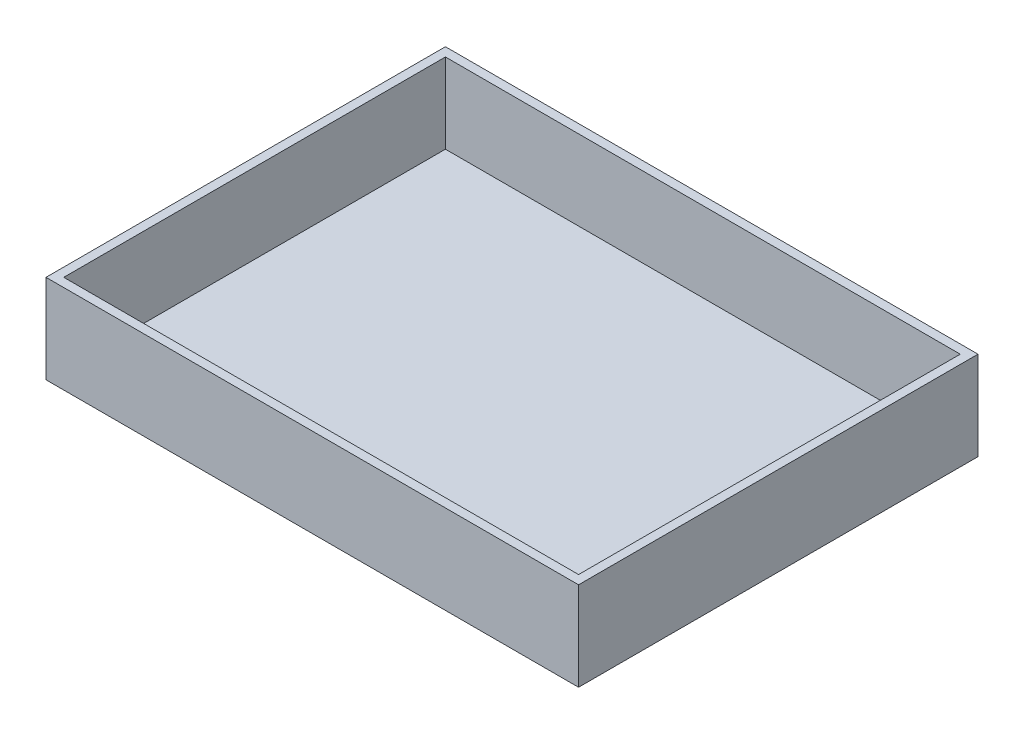
ISO-10303-21;
HEADER;
FILE_DESCRIPTION(('STEP AP214'),'2;1');
FILE_NAME('part.step','',(''),(''),'','','');
FILE_SCHEMA(('AUTOMOTIVE_DESIGN { 1 0 10303 214 1 1 1 1 }'));
ENDSEC;
DATA;
#1=APPLICATION_CONTEXT('core data for automotive mechanical design processes');
#2=APPLICATION_PROTOCOL_DEFINITION('international standard','automotive_design',2000,#1);
#3=PRODUCT_CONTEXT('',#1,'mechanical');
#4=PRODUCT('Part','Part','',(#3));
#5=PRODUCT_RELATED_PRODUCT_CATEGORY('part','',(#4));
#6=PRODUCT_DEFINITION_FORMATION('','',#4);
#7=PRODUCT_DEFINITION_CONTEXT('part definition',#1,'design');
#8=PRODUCT_DEFINITION('design','',#6,#7);
#9=PRODUCT_DEFINITION_SHAPE('','',#8);
#10=(LENGTH_UNIT() NAMED_UNIT(*) SI_UNIT(.MILLI.,.METRE.));
#11=(NAMED_UNIT(*) PLANE_ANGLE_UNIT() SI_UNIT($,.RADIAN.));
#12=(NAMED_UNIT(*) SI_UNIT($,.STERADIAN.) SOLID_ANGLE_UNIT());
#13=UNCERTAINTY_MEASURE_WITH_UNIT(LENGTH_MEASURE(1.E-05),#10,'distance_accuracy_value','');
#14=(GEOMETRIC_REPRESENTATION_CONTEXT(3) GLOBAL_UNCERTAINTY_ASSIGNED_CONTEXT((#13)) GLOBAL_UNIT_ASSIGNED_CONTEXT((#10,
#11,#12)) REPRESENTATION_CONTEXT('',''));
#15=CARTESIAN_POINT('',(0.,0.,0.));
#16=DIRECTION('',(0.,0.,1.));
#17=DIRECTION('',(1.,0.,0.));
#18=AXIS2_PLACEMENT_3D('',#15,#16,#17);
#19=CARTESIAN_POINT('',(0.,0.,-450.));
#20=DIRECTION('',(-1.,0.,0.));
#21=DIRECTION('',(0.,0.,1.));
#22=AXIS2_PLACEMENT_3D('',#19,#20,#21);
#23=PLANE('',#22);
#24=DIRECTION('',(0.,-1.,0.));
#25=VECTOR('',#24,1.);
#26=CARTESIAN_POINT('',(0.,0.,0.));
#27=LINE('',#26,#25);
#28=CARTESIAN_POINT('',(0.,0.,0.));
#29=VERTEX_POINT('',#28);
#30=CARTESIAN_POINT('',(0.,-100.,0.));
#31=VERTEX_POINT('',#30);
#32=EDGE_CURVE('E161',#29,#31,#27,.T.);
#33=ORIENTED_EDGE('',*,*,#32,.F.);
#34=DIRECTION('',(0.,0.,1.));
#35=VECTOR('',#34,1.);
#36=CARTESIAN_POINT('',(0.,0.,-450.));
#37=LINE('',#36,#35);
#38=CARTESIAN_POINT('',(0.,0.,-450.));
#39=VERTEX_POINT('',#38);
#40=EDGE_CURVE('E11',#39,#29,#37,.T.);
#41=ORIENTED_EDGE('',*,*,#40,.F.);
#42=DIRECTION('',(0.,-1.,0.));
#43=VECTOR('',#42,1.);
#44=CARTESIAN_POINT('',(0.,0.,-450.));
#45=LINE('',#44,#43);
#46=CARTESIAN_POINT('',(0.,-100.,-450.));
#47=VERTEX_POINT('',#46);
#48=EDGE_CURVE('E167',#39,#47,#45,.T.);
#49=ORIENTED_EDGE('',*,*,#48,.T.);
#50=DIRECTION('',(0.,0.,1.));
#51=VECTOR('',#50,1.);
#52=CARTESIAN_POINT('',(0.,-100.,-450.));
#53=LINE('',#52,#51);
#54=EDGE_CURVE('E46',#47,#31,#53,.T.);
#55=ORIENTED_EDGE('',*,*,#54,.T.);
#56=EDGE_LOOP('',(#33,#41,#49,#55));
#57=FACE_BOUND('',#56,.T.);
#58=ADVANCED_FACE('F43',(#57),#23,.T.);
#59=CARTESIAN_POINT('',(0.,0.,-450.));
#60=DIRECTION('',(0.,1.,0.));
#61=DIRECTION('',(0.,0.,1.));
#62=AXIS2_PLACEMENT_3D('',#59,#60,#61);
#63=PLANE('',#62);
#64=DIRECTION('',(0.,0.,1.));
#65=VECTOR('',#64,1.);
#66=CARTESIAN_POINT('',(10.,0.,-10.));
#67=LINE('',#66,#65);
#68=CARTESIAN_POINT('',(10.,0.,-440.));
#69=VERTEX_POINT('',#68);
#70=CARTESIAN_POINT('',(10.,0.,-10.));
#71=VERTEX_POINT('',#70);
#72=EDGE_CURVE('E60',#69,#71,#67,.T.);
#73=ORIENTED_EDGE('',*,*,#72,.F.);
#74=DIRECTION('',(-1.,0.,0.));
#75=VECTOR('',#74,1.);
#76=CARTESIAN_POINT('',(10.,0.,-440.));
#77=LINE('',#76,#75);
#78=CARTESIAN_POINT('',(590.,0.,-440.));
#79=VERTEX_POINT('',#78);
#80=EDGE_CURVE('E139',#79,#69,#77,.T.);
#81=ORIENTED_EDGE('',*,*,#80,.F.);
#82=DIRECTION('',(0.,0.,-1.));
#83=VECTOR('',#82,1.);
#84=CARTESIAN_POINT('',(590.,0.,-10.));
#85=LINE('',#84,#83);
#86=CARTESIAN_POINT('',(590.,0.,-10.));
#87=VERTEX_POINT('',#86);
#88=EDGE_CURVE('E143',#87,#79,#85,.T.);
#89=ORIENTED_EDGE('',*,*,#88,.F.);
#90=DIRECTION('',(1.,0.,0.));
#91=VECTOR('',#90,1.);
#92=CARTESIAN_POINT('',(10.,0.,-10.));
#93=LINE('',#92,#91);
#94=EDGE_CURVE('E152',#71,#87,#93,.T.);
#95=ORIENTED_EDGE('',*,*,#94,.F.);
#96=EDGE_LOOP('',(#73,#81,#89,#95));
#97=FACE_BOUND('',#96,.T.);
#98=DIRECTION('',(-1.,0.,0.));
#99=VECTOR('',#98,1.);
#100=CARTESIAN_POINT('',(0.,0.,0.));
#101=LINE('',#100,#99);
#102=CARTESIAN_POINT('',(600.,0.,0.));
#103=VERTEX_POINT('',#102);
#104=EDGE_CURVE('E171',#103,#29,#101,.T.);
#105=ORIENTED_EDGE('',*,*,#104,.F.);
#106=DIRECTION('',(0.,0.,1.));
#107=VECTOR('',#106,1.);
#108=CARTESIAN_POINT('',(600.,0.,-450.));
#109=LINE('',#108,#107);
#110=CARTESIAN_POINT('',(600.,0.,-450.));
#111=VERTEX_POINT('',#110);
#112=EDGE_CURVE('E52',#111,#103,#109,.T.);
#113=ORIENTED_EDGE('',*,*,#112,.F.);
#114=DIRECTION('',(-1.,0.,0.));
#115=VECTOR('',#114,1.);
#116=CARTESIAN_POINT('',(0.,0.,-450.));
#117=LINE('',#116,#115);
#118=EDGE_CURVE('E178',#111,#39,#117,.T.);
#119=ORIENTED_EDGE('',*,*,#118,.T.);
#120=ORIENTED_EDGE('',*,*,#40,.T.);
#121=EDGE_LOOP('',(#105,#113,#119,#120));
#122=FACE_BOUND('',#121,.T.);
#123=ADVANCED_FACE('F203',(#97,#122),#63,.T.);
#124=CARTESIAN_POINT('',(600.,0.,-450.));
#125=DIRECTION('',(1.,0.,0.));
#126=DIRECTION('',(0.,0.,-1.));
#127=AXIS2_PLACEMENT_3D('',#124,#125,#126);
#128=PLANE('',#127);
#129=DIRECTION('',(0.,1.,0.));
#130=VECTOR('',#129,1.);
#131=CARTESIAN_POINT('',(600.,0.,0.));
#132=LINE('',#131,#130);
#133=CARTESIAN_POINT('',(600.,-100.,0.));
#134=VERTEX_POINT('',#133);
#135=EDGE_CURVE('E188',#134,#103,#132,.T.);
#136=ORIENTED_EDGE('',*,*,#135,.F.);
#137=DIRECTION('',(0.,0.,1.));
#138=VECTOR('',#137,1.);
#139=CARTESIAN_POINT('',(600.,-100.,-450.));
#140=LINE('',#139,#138);
#141=CARTESIAN_POINT('',(600.,-100.,-450.));
#142=VERTEX_POINT('',#141);
#143=EDGE_CURVE('E196',#142,#134,#140,.T.);
#144=ORIENTED_EDGE('',*,*,#143,.F.);
#145=DIRECTION('',(0.,1.,0.));
#146=VECTOR('',#145,1.);
#147=CARTESIAN_POINT('',(600.,0.,-450.));
#148=LINE('',#147,#146);
#149=EDGE_CURVE('E174',#142,#111,#148,.T.);
#150=ORIENTED_EDGE('',*,*,#149,.T.);
#151=ORIENTED_EDGE('',*,*,#112,.T.);
#152=EDGE_LOOP('',(#136,#144,#150,#151));
#153=FACE_BOUND('',#152,.T.);
#154=ADVANCED_FACE('F207',(#153),#128,.T.);
#155=CARTESIAN_POINT('',(0.,-100.,-450.));
#156=DIRECTION('',(0.,-1.,0.));
#157=DIRECTION('',(0.,0.,-1.));
#158=AXIS2_PLACEMENT_3D('',#155,#156,#157);
#159=PLANE('',#158);
#160=DIRECTION('',(1.,0.,0.));
#161=VECTOR('',#160,1.);
#162=CARTESIAN_POINT('',(0.,-100.,0.));
#163=LINE('',#162,#161);
#164=EDGE_CURVE('E184',#31,#134,#163,.T.);
#165=ORIENTED_EDGE('',*,*,#164,.F.);
#166=ORIENTED_EDGE('',*,*,#54,.F.);
#167=DIRECTION('',(1.,0.,0.));
#168=VECTOR('',#167,1.);
#169=CARTESIAN_POINT('',(0.,-100.,-450.));
#170=LINE('',#169,#168);
#171=EDGE_CURVE('E170',#47,#142,#170,.T.);
#172=ORIENTED_EDGE('',*,*,#171,.T.);
#173=ORIENTED_EDGE('',*,*,#143,.T.);
#174=EDGE_LOOP('',(#165,#166,#172,#173));
#175=FACE_BOUND('',#174,.T.);
#176=ADVANCED_FACE('F200',(#175),#159,.T.);
#177=CARTESIAN_POINT('',(0.,0.,-450.));
#178=DIRECTION('',(0.,0.,1.));
#179=DIRECTION('',(1.,0.,0.));
#180=AXIS2_PLACEMENT_3D('',#177,#178,#179);
#181=PLANE('',#180);
#182=ORIENTED_EDGE('',*,*,#48,.F.);
#183=ORIENTED_EDGE('',*,*,#118,.F.);
#184=ORIENTED_EDGE('',*,*,#149,.F.);
#185=ORIENTED_EDGE('',*,*,#171,.F.);
#186=EDGE_LOOP('',(#182,#183,#184,#185));
#187=FACE_BOUND('',#186,.T.);
#188=ADVANCED_FACE('F209',(#187),#181,.F.);
#189=CARTESIAN_POINT('',(0.,0.,0.));
#190=DIRECTION('',(0.,0.,1.));
#191=DIRECTION('',(1.,0.,0.));
#192=AXIS2_PLACEMENT_3D('',#189,#190,#191);
#193=PLANE('',#192);
#194=ORIENTED_EDGE('',*,*,#32,.T.);
#195=ORIENTED_EDGE('',*,*,#164,.T.);
#196=ORIENTED_EDGE('',*,*,#135,.T.);
#197=ORIENTED_EDGE('',*,*,#104,.T.);
#198=EDGE_LOOP('',(#194,#195,#196,#197));
#199=FACE_BOUND('',#198,.T.);
#200=ADVANCED_FACE('F202',(#199),#193,.T.);
#201=CARTESIAN_POINT('',(10.,-90.,-10.));
#202=DIRECTION('',(-1.,0.,0.));
#203=DIRECTION('',(0.,0.,1.));
#204=AXIS2_PLACEMENT_3D('',#201,#202,#203);
#205=PLANE('',#204);
#206=ORIENTED_EDGE('',*,*,#72,.T.);
#207=DIRECTION('',(0.,1.,0.));
#208=VECTOR('',#207,1.);
#209=CARTESIAN_POINT('',(10.,-90.,-10.));
#210=LINE('',#209,#208);
#211=CARTESIAN_POINT('',(10.,-90.,-10.));
#212=VERTEX_POINT('',#211);
#213=EDGE_CURVE('E114',#212,#71,#210,.T.);
#214=ORIENTED_EDGE('',*,*,#213,.F.);
#215=DIRECTION('',(0.,0.,1.));
#216=VECTOR('',#215,1.);
#217=CARTESIAN_POINT('',(10.,-90.,-10.));
#218=LINE('',#217,#216);
#219=CARTESIAN_POINT('',(10.,-90.,-440.));
#220=VERTEX_POINT('',#219);
#221=EDGE_CURVE('E118',#220,#212,#218,.T.);
#222=ORIENTED_EDGE('',*,*,#221,.F.);
#223=DIRECTION('',(0.,1.,0.));
#224=VECTOR('',#223,1.);
#225=CARTESIAN_POINT('',(10.,-90.,-440.));
#226=LINE('',#225,#224);
#227=EDGE_CURVE('E158',#220,#69,#226,.T.);
#228=ORIENTED_EDGE('',*,*,#227,.T.);
#229=EDGE_LOOP('',(#206,#214,#222,#228));
#230=FACE_BOUND('',#229,.T.);
#231=ADVANCED_FACE('F116',(#230),#205,.F.);
#232=CARTESIAN_POINT('',(10.,-90.,-440.));
#233=DIRECTION('',(0.,0.,-1.));
#234=DIRECTION('',(-1.,0.,0.));
#235=AXIS2_PLACEMENT_3D('',#232,#233,#234);
#236=PLANE('',#235);
#237=ORIENTED_EDGE('',*,*,#80,.T.);
#238=ORIENTED_EDGE('',*,*,#227,.F.);
#239=DIRECTION('',(-1.,0.,0.));
#240=VECTOR('',#239,1.);
#241=CARTESIAN_POINT('',(10.,-90.,-440.));
#242=LINE('',#241,#240);
#243=CARTESIAN_POINT('',(590.,-90.,-440.));
#244=VERTEX_POINT('',#243);
#245=EDGE_CURVE('E125',#244,#220,#242,.T.);
#246=ORIENTED_EDGE('',*,*,#245,.F.);
#247=DIRECTION('',(0.,1.,0.));
#248=VECTOR('',#247,1.);
#249=CARTESIAN_POINT('',(590.,-90.,-440.));
#250=LINE('',#249,#248);
#251=EDGE_CURVE('E162',#244,#79,#250,.T.);
#252=ORIENTED_EDGE('',*,*,#251,.T.);
#253=EDGE_LOOP('',(#237,#238,#246,#252));
#254=FACE_BOUND('',#253,.T.);
#255=ADVANCED_FACE('F233',(#254),#236,.F.);
#256=CARTESIAN_POINT('',(590.,-90.,-10.));
#257=DIRECTION('',(1.,0.,0.));
#258=DIRECTION('',(0.,0.,-1.));
#259=AXIS2_PLACEMENT_3D('',#256,#257,#258);
#260=PLANE('',#259);
#261=ORIENTED_EDGE('',*,*,#88,.T.);
#262=ORIENTED_EDGE('',*,*,#251,.F.);
#263=DIRECTION('',(0.,0.,-1.));
#264=VECTOR('',#263,1.);
#265=CARTESIAN_POINT('',(590.,-90.,-10.));
#266=LINE('',#265,#264);
#267=CARTESIAN_POINT('',(590.,-90.,-10.));
#268=VERTEX_POINT('',#267);
#269=EDGE_CURVE('E134',#268,#244,#266,.T.);
#270=ORIENTED_EDGE('',*,*,#269,.F.);
#271=DIRECTION('',(0.,1.,0.));
#272=VECTOR('',#271,1.);
#273=CARTESIAN_POINT('',(590.,-90.,-10.));
#274=LINE('',#273,#272);
#275=EDGE_CURVE('E124',#268,#87,#274,.T.);
#276=ORIENTED_EDGE('',*,*,#275,.T.);
#277=EDGE_LOOP('',(#261,#262,#270,#276));
#278=FACE_BOUND('',#277,.T.);
#279=ADVANCED_FACE('F231',(#278),#260,.F.);
#280=CARTESIAN_POINT('',(10.,-90.,-10.));
#281=DIRECTION('',(0.,0.,1.));
#282=DIRECTION('',(1.,0.,0.));
#283=AXIS2_PLACEMENT_3D('',#280,#281,#282);
#284=PLANE('',#283);
#285=ORIENTED_EDGE('',*,*,#94,.T.);
#286=ORIENTED_EDGE('',*,*,#275,.F.);
#287=DIRECTION('',(1.,0.,0.));
#288=VECTOR('',#287,1.);
#289=CARTESIAN_POINT('',(10.,-90.,-10.));
#290=LINE('',#289,#288);
#291=EDGE_CURVE('E128',#212,#268,#290,.T.);
#292=ORIENTED_EDGE('',*,*,#291,.F.);
#293=ORIENTED_EDGE('',*,*,#213,.T.);
#294=EDGE_LOOP('',(#285,#286,#292,#293));
#295=FACE_BOUND('',#294,.T.);
#296=ADVANCED_FACE('F129',(#295),#284,.F.);
#297=CARTESIAN_POINT('',(0.,-90.,0.));
#298=DIRECTION('',(0.,-1.,0.));
#299=DIRECTION('',(0.,0.,-1.));
#300=AXIS2_PLACEMENT_3D('',#297,#298,#299);
#301=PLANE('',#300);
#302=ORIENTED_EDGE('',*,*,#221,.T.);
#303=ORIENTED_EDGE('',*,*,#291,.T.);
#304=ORIENTED_EDGE('',*,*,#269,.T.);
#305=ORIENTED_EDGE('',*,*,#245,.T.);
#306=EDGE_LOOP('',(#302,#303,#304,#305));
#307=FACE_BOUND('',#306,.T.);
#308=ADVANCED_FACE('F136',(#307),#301,.F.);
#309=CLOSED_SHELL('',(#58,#123,#154,#176,#188,#200,#231,#255,#279,#296,#308));
#310=MANIFOLD_SOLID_BREP('B2',#309);
#311=ADVANCED_BREP_SHAPE_REPRESENTATION('',(#18,#310),#14);
#312=SHAPE_DEFINITION_REPRESENTATION(#9,#311);
ENDSEC;
END-ISO-10303-21;
